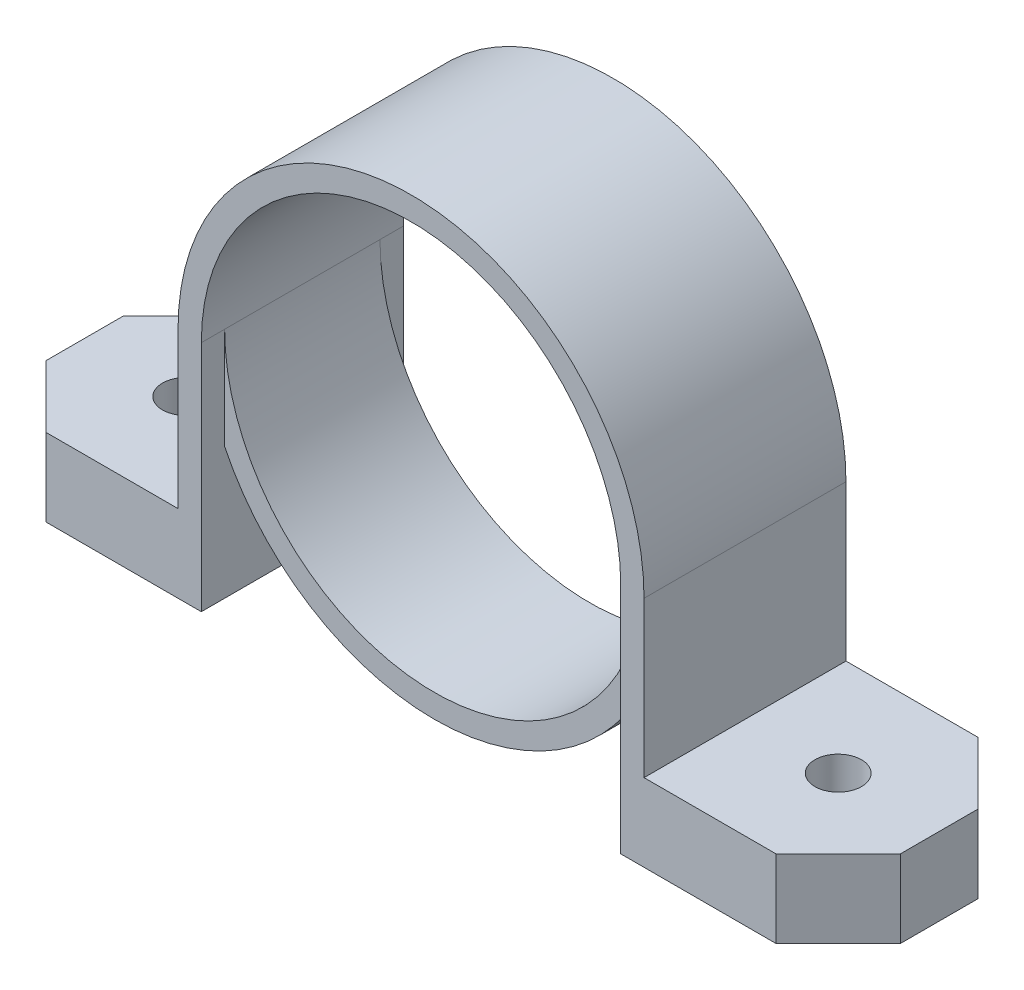
ISO-10303-21;
HEADER;
FILE_DESCRIPTION(('STEP AP214'),'2;1');
FILE_NAME('part.step','',(''),(''),'','','');
FILE_SCHEMA(('AUTOMOTIVE_DESIGN { 1 0 10303 214 1 1 1 1 }'));
ENDSEC;
DATA;
#1=APPLICATION_CONTEXT('core data for automotive mechanical design processes');
#2=APPLICATION_PROTOCOL_DEFINITION('international standard','automotive_design',2000,#1);
#3=PRODUCT_CONTEXT('',#1,'mechanical');
#4=PRODUCT('Part','Part','',(#3));
#5=PRODUCT_RELATED_PRODUCT_CATEGORY('part','',(#4));
#6=PRODUCT_DEFINITION_FORMATION('','',#4);
#7=PRODUCT_DEFINITION_CONTEXT('part definition',#1,'design');
#8=PRODUCT_DEFINITION('design','',#6,#7);
#9=PRODUCT_DEFINITION_SHAPE('','',#8);
#10=(LENGTH_UNIT() NAMED_UNIT(*) SI_UNIT(.MILLI.,.METRE.));
#11=(NAMED_UNIT(*) PLANE_ANGLE_UNIT() SI_UNIT($,.RADIAN.));
#12=(NAMED_UNIT(*) SI_UNIT($,.STERADIAN.) SOLID_ANGLE_UNIT());
#13=UNCERTAINTY_MEASURE_WITH_UNIT(LENGTH_MEASURE(1.E-05),#10,'distance_accuracy_value','');
#14=(GEOMETRIC_REPRESENTATION_CONTEXT(3) GLOBAL_UNCERTAINTY_ASSIGNED_CONTEXT((#13)) GLOBAL_UNIT_ASSIGNED_CONTEXT((#10,
#11,#12)) REPRESENTATION_CONTEXT('',''));
#15=CARTESIAN_POINT('',(0.,0.,0.));
#16=DIRECTION('',(0.,0.,1.));
#17=DIRECTION('',(1.,0.,0.));
#18=AXIS2_PLACEMENT_3D('',#15,#16,#17);
#19=CARTESIAN_POINT('',(0.,0.,-5.));
#20=DIRECTION('',(0.,0.,1.));
#21=DIRECTION('',(1.,0.,0.));
#22=AXIS2_PLACEMENT_3D('',#19,#20,#21);
#23=CYLINDRICAL_SURFACE('',#22,15.);
#24=DIRECTION('',(0.,0.,1.));
#25=VECTOR('',#24,1.);
#26=CARTESIAN_POINT('',(13.5,-6.53834841531101,-5.));
#27=LINE('',#26,#25);
#28=CARTESIAN_POINT('',(13.5,-6.53834841531101,-5.));
#29=VERTEX_POINT('',#28);
#30=CARTESIAN_POINT('',(13.5,-6.53834841531101,5.));
#31=VERTEX_POINT('',#30);
#32=EDGE_CURVE('E56',#29,#31,#27,.T.);
#33=ORIENTED_EDGE('',*,*,#32,.T.);
#34=CARTESIAN_POINT('',(0.,0.,5.));
#35=DIRECTION('',(0.,0.,1.));
#36=DIRECTION('',(1.,0.,0.));
#37=AXIS2_PLACEMENT_3D('',#34,#35,#36);
#38=CIRCLE('',#37,15.);
#39=CARTESIAN_POINT('',(-13.5,-6.53834841531101,5.));
#40=VERTEX_POINT('',#39);
#41=EDGE_CURVE('E93',#40,#31,#38,.T.);
#42=ORIENTED_EDGE('',*,*,#41,.F.);
#43=DIRECTION('',(0.,0.,1.));
#44=VECTOR('',#43,1.);
#45=CARTESIAN_POINT('',(-13.5,-6.53834841531101,-5.));
#46=LINE('',#45,#44);
#47=CARTESIAN_POINT('',(-13.5,-6.53834841531101,-5.));
#48=VERTEX_POINT('',#47);
#49=EDGE_CURVE('E12',#48,#40,#46,.T.);
#50=ORIENTED_EDGE('',*,*,#49,.F.);
#51=CARTESIAN_POINT('',(0.,0.,-5.));
#52=DIRECTION('',(0.,0.,1.));
#53=DIRECTION('',(1.,0.,0.));
#54=AXIS2_PLACEMENT_3D('',#51,#52,#53);
#55=CIRCLE('',#54,15.);
#56=EDGE_CURVE('E95',#48,#29,#55,.T.);
#57=ORIENTED_EDGE('',*,*,#56,.T.);
#58=EDGE_LOOP('',(#33,#42,#50,#57));
#59=FACE_BOUND('',#58,.T.);
#60=ADVANCED_FACE('F53',(#59),#23,.T.);
#61=CARTESIAN_POINT('',(-13.5,0.,-5.));
#62=DIRECTION('',(1.,0.,0.));
#63=DIRECTION('',(0.,1.,0.));
#64=AXIS2_PLACEMENT_3D('',#61,#62,#63);
#65=PLANE('',#64);
#66=ORIENTED_EDGE('',*,*,#49,.T.);
#67=DIRECTION('',(0.,1.,0.));
#68=VECTOR('',#67,1.);
#69=CARTESIAN_POINT('',(-13.5,0.,5.));
#70=LINE('',#69,#68);
#71=CARTESIAN_POINT('',(-13.5,0.,5.));
#72=VERTEX_POINT('',#71);
#73=EDGE_CURVE('E111',#40,#72,#70,.T.);
#74=ORIENTED_EDGE('',*,*,#73,.T.);
#75=DIRECTION('',(0.,0.,1.));
#76=VECTOR('',#75,1.);
#77=CARTESIAN_POINT('',(-13.5,0.,-5.));
#78=LINE('',#77,#76);
#79=CARTESIAN_POINT('',(-13.5,0.,-5.));
#80=VERTEX_POINT('',#79);
#81=EDGE_CURVE('E61',#80,#72,#78,.T.);
#82=ORIENTED_EDGE('',*,*,#81,.F.);
#83=DIRECTION('',(0.,1.,0.));
#84=VECTOR('',#83,1.);
#85=CARTESIAN_POINT('',(-13.5,0.,-5.));
#86=LINE('',#85,#84);
#87=EDGE_CURVE('E74',#48,#80,#86,.T.);
#88=ORIENTED_EDGE('',*,*,#87,.F.);
#89=EDGE_LOOP('',(#66,#74,#82,#88));
#90=FACE_BOUND('',#89,.T.);
#91=ADVANCED_FACE('F126',(#90),#65,.F.);
#92=CARTESIAN_POINT('',(0.,0.,-5.));
#93=DIRECTION('',(0.,0.,1.));
#94=DIRECTION('',(1.,0.,0.));
#95=AXIS2_PLACEMENT_3D('',#92,#93,#94);
#96=CYLINDRICAL_SURFACE('',#95,13.5);
#97=ORIENTED_EDGE('',*,*,#81,.T.);
#98=CARTESIAN_POINT('',(0.,0.,5.));
#99=DIRECTION('',(0.,0.,1.));
#100=DIRECTION('',(1.,0.,0.));
#101=AXIS2_PLACEMENT_3D('',#98,#99,#100);
#102=CIRCLE('',#101,13.5);
#103=CARTESIAN_POINT('',(13.5,0.,5.));
#104=VERTEX_POINT('',#103);
#105=EDGE_CURVE('E107',#72,#104,#102,.T.);
#106=ORIENTED_EDGE('',*,*,#105,.T.);
#107=DIRECTION('',(0.,0.,1.));
#108=VECTOR('',#107,1.);
#109=CARTESIAN_POINT('',(13.5,0.,-5.));
#110=LINE('',#109,#108);
#111=CARTESIAN_POINT('',(13.5,0.,-5.));
#112=VERTEX_POINT('',#111);
#113=EDGE_CURVE('E99',#112,#104,#110,.T.);
#114=ORIENTED_EDGE('',*,*,#113,.F.);
#115=CARTESIAN_POINT('',(0.,0.,-5.));
#116=DIRECTION('',(0.,0.,1.));
#117=DIRECTION('',(1.,0.,0.));
#118=AXIS2_PLACEMENT_3D('',#115,#116,#117);
#119=CIRCLE('',#118,13.5);
#120=EDGE_CURVE('E119',#80,#112,#119,.T.);
#121=ORIENTED_EDGE('',*,*,#120,.F.);
#122=EDGE_LOOP('',(#97,#106,#114,#121));
#123=FACE_BOUND('',#122,.T.);
#124=ADVANCED_FACE('F124',(#123),#96,.F.);
#125=CARTESIAN_POINT('',(13.5,0.,-5.));
#126=DIRECTION('',(1.,0.,0.));
#127=DIRECTION('',(0.,1.,0.));
#128=AXIS2_PLACEMENT_3D('',#125,#126,#127);
#129=PLANE('',#128);
#130=ORIENTED_EDGE('',*,*,#113,.T.);
#131=DIRECTION('',(0.,1.,0.));
#132=VECTOR('',#131,1.);
#133=CARTESIAN_POINT('',(13.5,0.,5.));
#134=LINE('',#133,#132);
#135=EDGE_CURVE('E101',#31,#104,#134,.T.);
#136=ORIENTED_EDGE('',*,*,#135,.F.);
#137=ORIENTED_EDGE('',*,*,#32,.F.);
#138=DIRECTION('',(0.,1.,0.));
#139=VECTOR('',#138,1.);
#140=CARTESIAN_POINT('',(13.5,0.,-5.));
#141=LINE('',#140,#139);
#142=EDGE_CURVE('E117',#29,#112,#141,.T.);
#143=ORIENTED_EDGE('',*,*,#142,.T.);
#144=EDGE_LOOP('',(#130,#136,#137,#143));
#145=FACE_BOUND('',#144,.T.);
#146=ADVANCED_FACE('F102',(#145),#129,.T.);
#147=CARTESIAN_POINT('',(0.,0.,-5.));
#148=DIRECTION('',(0.,0.,1.));
#149=DIRECTION('',(1.,0.,0.));
#150=AXIS2_PLACEMENT_3D('',#147,#148,#149);
#151=PLANE('',#150);
#152=ORIENTED_EDGE('',*,*,#56,.F.);
#153=ORIENTED_EDGE('',*,*,#87,.T.);
#154=ORIENTED_EDGE('',*,*,#120,.T.);
#155=ORIENTED_EDGE('',*,*,#142,.F.);
#156=EDGE_LOOP('',(#152,#153,#154,#155));
#157=FACE_BOUND('',#156,.T.);
#158=ADVANCED_FACE('F127',(#157),#151,.F.);
#159=CARTESIAN_POINT('',(0.,0.,5.));
#160=DIRECTION('',(0.,0.,1.));
#161=DIRECTION('',(1.,0.,0.));
#162=AXIS2_PLACEMENT_3D('',#159,#160,#161);
#163=PLANE('',#162);
#164=ORIENTED_EDGE('',*,*,#41,.T.);
#165=ORIENTED_EDGE('',*,*,#135,.T.);
#166=ORIENTED_EDGE('',*,*,#105,.F.);
#167=ORIENTED_EDGE('',*,*,#73,.F.);
#168=EDGE_LOOP('',(#164,#165,#166,#167));
#169=FACE_BOUND('',#168,.T.);
#170=ADVANCED_FACE('F109',(#169),#163,.T.);
#171=CLOSED_SHELL('',(#60,#91,#124,#146,#158,#170));
#172=MANIFOLD_SOLID_BREP('B2',#171);
#173=CARTESIAN_POINT('',(0.,0.,-6.5));
#174=DIRECTION('',(0.,0.,1.));
#175=DIRECTION('',(1.,0.,0.));
#176=AXIS2_PLACEMENT_3D('',#173,#174,#175);
#177=CYLINDRICAL_SURFACE('',#176,13.5);
#178=DIRECTION('',(0.,0.,1.));
#179=VECTOR('',#178,1.);
#180=CARTESIAN_POINT('',(13.5,0.,-6.5));
#181=LINE('',#180,#179);
#182=CARTESIAN_POINT('',(13.5,0.,-6.5));
#183=VERTEX_POINT('',#182);
#184=CARTESIAN_POINT('',(13.5,0.,6.5));
#185=VERTEX_POINT('',#184);
#186=EDGE_CURVE('E378',#183,#185,#181,.T.);
#187=ORIENTED_EDGE('',*,*,#186,.T.);
#188=CARTESIAN_POINT('',(0.,0.,6.5));
#189=DIRECTION('',(0.,0.,1.));
#190=DIRECTION('',(1.,0.,0.));
#191=AXIS2_PLACEMENT_3D('',#188,#189,#190);
#192=CIRCLE('',#191,13.5);
#193=CARTESIAN_POINT('',(-13.5,0.,6.5));
#194=VERTEX_POINT('',#193);
#195=EDGE_CURVE('E442',#185,#194,#192,.T.);
#196=ORIENTED_EDGE('',*,*,#195,.T.);
#197=DIRECTION('',(0.,0.,1.));
#198=VECTOR('',#197,1.);
#199=CARTESIAN_POINT('',(-13.5,0.,-6.5));
#200=LINE('',#199,#198);
#201=CARTESIAN_POINT('',(-13.5,0.,-6.5));
#202=VERTEX_POINT('',#201);
#203=EDGE_CURVE('E308',#202,#194,#200,.T.);
#204=ORIENTED_EDGE('',*,*,#203,.F.);
#205=CARTESIAN_POINT('',(0.,0.,-6.5));
#206=DIRECTION('',(0.,0.,1.));
#207=DIRECTION('',(1.,0.,0.));
#208=AXIS2_PLACEMENT_3D('',#205,#206,#207);
#209=CIRCLE('',#208,13.5);
#210=EDGE_CURVE('E341',#183,#202,#209,.T.);
#211=ORIENTED_EDGE('',*,*,#210,.F.);
#212=EDGE_LOOP('',(#187,#196,#204,#211));
#213=FACE_BOUND('',#212,.T.);
#214=ADVANCED_FACE('F183',(#213),#177,.F.);
#215=CARTESIAN_POINT('',(-13.5,0.,-6.5));
#216=DIRECTION('',(-1.,0.,0.));
#217=DIRECTION('',(0.,-1.,0.));
#218=AXIS2_PLACEMENT_3D('',#215,#216,#217);
#219=PLANE('',#218);
#220=ORIENTED_EDGE('',*,*,#203,.T.);
#221=DIRECTION('',(0.,-1.,0.));
#222=VECTOR('',#221,1.);
#223=CARTESIAN_POINT('',(-13.5,0.,6.5));
#224=LINE('',#223,#222);
#225=CARTESIAN_POINT('',(-13.5,-15.,6.5));
#226=VERTEX_POINT('',#225);
#227=EDGE_CURVE('E332',#194,#226,#224,.T.);
#228=ORIENTED_EDGE('',*,*,#227,.T.);
#229=DIRECTION('',(0.,0.,1.));
#230=VECTOR('',#229,1.);
#231=CARTESIAN_POINT('',(-13.5,-15.,-6.5));
#232=LINE('',#231,#230);
#233=CARTESIAN_POINT('',(-13.5,-15.,-6.5));
#234=VERTEX_POINT('',#233);
#235=EDGE_CURVE('E381',#234,#226,#232,.T.);
#236=ORIENTED_EDGE('',*,*,#235,.F.);
#237=DIRECTION('',(0.,-1.,0.));
#238=VECTOR('',#237,1.);
#239=CARTESIAN_POINT('',(-13.5,0.,-6.5));
#240=LINE('',#239,#238);
#241=EDGE_CURVE('E374',#202,#234,#240,.T.);
#242=ORIENTED_EDGE('',*,*,#241,.F.);
#243=EDGE_LOOP('',(#220,#228,#236,#242));
#244=FACE_BOUND('',#243,.T.);
#245=ADVANCED_FACE('F538',(#244),#219,.F.);
#246=CARTESIAN_POINT('',(0.,-15.,-6.5));
#247=DIRECTION('',(0.,-1.,0.));
#248=DIRECTION('',(1.,0.,0.));
#249=AXIS2_PLACEMENT_3D('',#246,#247,#248);
#250=PLANE('',#249);
#251=DIRECTION('',(-0.707106781186549,0.,0.707106781186546));
#252=VECTOR('',#251,1.);
#253=CARTESIAN_POINT('',(-11.75,-15.,-18.25));
#254=LINE('',#253,#252);
#255=CARTESIAN_POINT('',(-23.5,-15.,-6.5));
#256=VERTEX_POINT('',#255);
#257=CARTESIAN_POINT('',(-27.5,-15.,-2.5));
#258=VERTEX_POINT('',#257);
#259=EDGE_CURVE('E423',#256,#258,#254,.T.);
#260=ORIENTED_EDGE('',*,*,#259,.F.);
#261=DIRECTION('',(1.,0.,0.));
#262=VECTOR('',#261,1.);
#263=CARTESIAN_POINT('',(0.,-15.,-6.5));
#264=LINE('',#263,#262);
#265=EDGE_CURVE('E371',#256,#234,#264,.T.);
#266=ORIENTED_EDGE('',*,*,#265,.T.);
#267=ORIENTED_EDGE('',*,*,#235,.T.);
#268=DIRECTION('',(1.,0.,0.));
#269=VECTOR('',#268,1.);
#270=CARTESIAN_POINT('',(0.,-15.,6.5));
#271=LINE('',#270,#269);
#272=CARTESIAN_POINT('',(-23.5,-15.,6.5));
#273=VERTEX_POINT('',#272);
#274=EDGE_CURVE('E328',#273,#226,#271,.T.);
#275=ORIENTED_EDGE('',*,*,#274,.F.);
#276=DIRECTION('',(0.707106781186549,0.,0.707106781186546));
#277=VECTOR('',#276,1.);
#278=CARTESIAN_POINT('',(-18.2499999999999,-15.,11.75));
#279=LINE('',#278,#277);
#280=CARTESIAN_POINT('',(-27.5,-15.,2.5));
#281=VERTEX_POINT('',#280);
#282=EDGE_CURVE('E302',#281,#273,#279,.T.);
#283=ORIENTED_EDGE('',*,*,#282,.F.);
#284=DIRECTION('',(0.,0.,1.));
#285=VECTOR('',#284,1.);
#286=CARTESIAN_POINT('',(-27.5,-15.,-6.5));
#287=LINE('',#286,#285);
#288=EDGE_CURVE('E385',#258,#281,#287,.T.);
#289=ORIENTED_EDGE('',*,*,#288,.F.);
#290=EDGE_LOOP('',(#260,#266,#267,#275,#283,#289));
#291=FACE_BOUND('',#290,.T.);
#292=CARTESIAN_POINT('',(-21.,-15.,0.));
#293=DIRECTION('',(0.,-1.,0.));
#294=DIRECTION('',(1.,0.,0.));
#295=AXIS2_PLACEMENT_3D('',#292,#293,#294);
#296=CIRCLE('',#295,1.5);
#297=CARTESIAN_POINT('',(-19.5,-15.,0.));
#298=VERTEX_POINT('',#297);
#299=EDGE_CURVE('E438',#298,#298,#296,.T.);
#300=ORIENTED_EDGE('',*,*,#299,.F.);
#301=EDGE_LOOP('',(#300));
#302=FACE_BOUND('',#301,.T.);
#303=ADVANCED_FACE('F477',(#291,#302),#250,.T.);
#304=CARTESIAN_POINT('',(-27.5,0.,-6.5));
#305=DIRECTION('',(-1.,0.,0.));
#306=DIRECTION('',(0.,0.,1.));
#307=AXIS2_PLACEMENT_3D('',#304,#305,#306);
#308=PLANE('',#307);
#309=DIRECTION('',(0.,-1.,0.));
#310=VECTOR('',#309,1.);
#311=CARTESIAN_POINT('',(-27.5,15.,-2.5));
#312=LINE('',#311,#310);
#313=CARTESIAN_POINT('',(-27.5,-10.,-2.5));
#314=VERTEX_POINT('',#313);
#315=EDGE_CURVE('E481',#314,#258,#312,.T.);
#316=ORIENTED_EDGE('',*,*,#315,.T.);
#317=ORIENTED_EDGE('',*,*,#288,.T.);
#318=DIRECTION('',(0.,-1.,0.));
#319=VECTOR('',#318,1.);
#320=CARTESIAN_POINT('',(-27.5,15.,2.5));
#321=LINE('',#320,#319);
#322=CARTESIAN_POINT('',(-27.5,-10.,2.5));
#323=VERTEX_POINT('',#322);
#324=EDGE_CURVE('E319',#323,#281,#321,.T.);
#325=ORIENTED_EDGE('',*,*,#324,.F.);
#326=DIRECTION('',(0.,0.,1.));
#327=VECTOR('',#326,1.);
#328=CARTESIAN_POINT('',(-27.5,-10.,-6.5));
#329=LINE('',#328,#327);
#330=EDGE_CURVE('E317',#314,#323,#329,.T.);
#331=ORIENTED_EDGE('',*,*,#330,.F.);
#332=EDGE_LOOP('',(#316,#317,#325,#331));
#333=FACE_BOUND('',#332,.T.);
#334=ADVANCED_FACE('F480',(#333),#308,.T.);
#335=CARTESIAN_POINT('',(0.,-10.,-6.5));
#336=DIRECTION('',(0.,1.,0.));
#337=DIRECTION('',(0.,0.,1.));
#338=AXIS2_PLACEMENT_3D('',#335,#336,#337);
#339=PLANE('',#338);
#340=DIRECTION('',(0.707106781186549,0.,-0.707106781186546));
#341=VECTOR('',#340,1.);
#342=CARTESIAN_POINT('',(-11.75,-10.,-18.25));
#343=LINE('',#342,#341);
#344=CARTESIAN_POINT('',(-23.5,-10.,-6.5));
#345=VERTEX_POINT('',#344);
#346=EDGE_CURVE('E208',#314,#345,#343,.T.);
#347=ORIENTED_EDGE('',*,*,#346,.F.);
#348=ORIENTED_EDGE('',*,*,#330,.T.);
#349=DIRECTION('',(-0.707106781186549,0.,-0.707106781186546));
#350=VECTOR('',#349,1.);
#351=CARTESIAN_POINT('',(-18.25,-10.,11.75));
#352=LINE('',#351,#350);
#353=CARTESIAN_POINT('',(-23.5,-10.,6.5));
#354=VERTEX_POINT('',#353);
#355=EDGE_CURVE('E299',#354,#323,#352,.T.);
#356=ORIENTED_EDGE('',*,*,#355,.F.);
#357=DIRECTION('',(-1.,0.,0.));
#358=VECTOR('',#357,1.);
#359=CARTESIAN_POINT('',(0.,-10.,6.5));
#360=LINE('',#359,#358);
#361=CARTESIAN_POINT('',(-15.,-10.,6.5));
#362=VERTEX_POINT('',#361);
#363=EDGE_CURVE('E315',#362,#354,#360,.T.);
#364=ORIENTED_EDGE('',*,*,#363,.F.);
#365=DIRECTION('',(0.,0.,1.));
#366=VECTOR('',#365,1.);
#367=CARTESIAN_POINT('',(-15.,-10.,-6.5));
#368=LINE('',#367,#366);
#369=CARTESIAN_POINT('',(-15.,-10.,-6.5));
#370=VERTEX_POINT('',#369);
#371=EDGE_CURVE('E391',#370,#362,#368,.T.);
#372=ORIENTED_EDGE('',*,*,#371,.F.);
#373=DIRECTION('',(-1.,0.,0.));
#374=VECTOR('',#373,1.);
#375=CARTESIAN_POINT('',(0.,-10.,-6.5));
#376=LINE('',#375,#374);
#377=EDGE_CURVE('E367',#370,#345,#376,.T.);
#378=ORIENTED_EDGE('',*,*,#377,.T.);
#379=EDGE_LOOP('',(#347,#348,#356,#364,#372,#378));
#380=FACE_BOUND('',#379,.T.);
#381=CARTESIAN_POINT('',(-21.,-10.,0.));
#382=DIRECTION('',(0.,1.,0.));
#383=DIRECTION('',(0.,0.,1.));
#384=AXIS2_PLACEMENT_3D('',#381,#382,#383);
#385=CIRCLE('',#384,1.5);
#386=CARTESIAN_POINT('',(-19.5,-10.,0.));
#387=VERTEX_POINT('',#386);
#388=EDGE_CURVE('E186',#387,#387,#385,.T.);
#389=ORIENTED_EDGE('',*,*,#388,.F.);
#390=EDGE_LOOP('',(#389));
#391=FACE_BOUND('',#390,.T.);
#392=ADVANCED_FACE('F313',(#380,#391),#339,.T.);
#393=CARTESIAN_POINT('',(-15.,0.,-6.5));
#394=DIRECTION('',(-1.,0.,0.));
#395=DIRECTION('',(0.,-1.,0.));
#396=AXIS2_PLACEMENT_3D('',#393,#394,#395);
#397=PLANE('',#396);
#398=ORIENTED_EDGE('',*,*,#371,.T.);
#399=DIRECTION('',(0.,-1.,0.));
#400=VECTOR('',#399,1.);
#401=CARTESIAN_POINT('',(-15.,0.,6.5));
#402=LINE('',#401,#400);
#403=CARTESIAN_POINT('',(-15.,0.,6.5));
#404=VERTEX_POINT('',#403);
#405=EDGE_CURVE('E326',#404,#362,#402,.T.);
#406=ORIENTED_EDGE('',*,*,#405,.F.);
#407=DIRECTION('',(0.,0.,1.));
#408=VECTOR('',#407,1.);
#409=CARTESIAN_POINT('',(-15.,0.,-6.5));
#410=LINE('',#409,#408);
#411=CARTESIAN_POINT('',(-15.,0.,-6.5));
#412=VERTEX_POINT('',#411);
#413=EDGE_CURVE('E394',#412,#404,#410,.T.);
#414=ORIENTED_EDGE('',*,*,#413,.F.);
#415=DIRECTION('',(0.,-1.,0.));
#416=VECTOR('',#415,1.);
#417=CARTESIAN_POINT('',(-15.,0.,-6.5));
#418=LINE('',#417,#416);
#419=EDGE_CURVE('E363',#412,#370,#418,.T.);
#420=ORIENTED_EDGE('',*,*,#419,.T.);
#421=EDGE_LOOP('',(#398,#406,#414,#420));
#422=FACE_BOUND('',#421,.T.);
#423=ADVANCED_FACE('F467',(#422),#397,.T.);
#424=CARTESIAN_POINT('',(0.,0.,-6.5));
#425=DIRECTION('',(0.,0.,1.));
#426=DIRECTION('',(1.,0.,0.));
#427=AXIS2_PLACEMENT_3D('',#424,#425,#426);
#428=CYLINDRICAL_SURFACE('',#427,15.);
#429=ORIENTED_EDGE('',*,*,#413,.T.);
#430=CARTESIAN_POINT('',(0.,0.,6.5));
#431=DIRECTION('',(0.,0.,1.));
#432=DIRECTION('',(1.,0.,0.));
#433=AXIS2_PLACEMENT_3D('',#430,#431,#432);
#434=CIRCLE('',#433,15.);
#435=CARTESIAN_POINT('',(15.,0.,6.5));
#436=VERTEX_POINT('',#435);
#437=EDGE_CURVE('E334',#436,#404,#434,.T.);
#438=ORIENTED_EDGE('',*,*,#437,.F.);
#439=DIRECTION('',(0.,0.,1.));
#440=VECTOR('',#439,1.);
#441=CARTESIAN_POINT('',(15.,0.,-6.5));
#442=LINE('',#441,#440);
#443=CARTESIAN_POINT('',(15.,0.,-6.5));
#444=VERTEX_POINT('',#443);
#445=EDGE_CURVE('E397',#444,#436,#442,.T.);
#446=ORIENTED_EDGE('',*,*,#445,.F.);
#447=CARTESIAN_POINT('',(0.,0.,-6.5));
#448=DIRECTION('',(0.,0.,1.));
#449=DIRECTION('',(1.,0.,0.));
#450=AXIS2_PLACEMENT_3D('',#447,#448,#449);
#451=CIRCLE('',#450,15.);
#452=EDGE_CURVE('E359',#444,#412,#451,.T.);
#453=ORIENTED_EDGE('',*,*,#452,.T.);
#454=EDGE_LOOP('',(#429,#438,#446,#453));
#455=FACE_BOUND('',#454,.T.);
#456=ADVANCED_FACE('F569',(#455),#428,.T.);
#457=CARTESIAN_POINT('',(15.,0.,-6.5));
#458=DIRECTION('',(-1.,0.,0.));
#459=DIRECTION('',(0.,-1.,0.));
#460=AXIS2_PLACEMENT_3D('',#457,#458,#459);
#461=PLANE('',#460);
#462=ORIENTED_EDGE('',*,*,#445,.T.);
#463=DIRECTION('',(0.,-1.,0.));
#464=VECTOR('',#463,1.);
#465=CARTESIAN_POINT('',(15.,0.,6.5));
#466=LINE('',#465,#464);
#467=CARTESIAN_POINT('',(15.,-9.99999999999999,6.5));
#468=VERTEX_POINT('',#467);
#469=EDGE_CURVE('E458',#436,#468,#466,.T.);
#470=ORIENTED_EDGE('',*,*,#469,.T.);
#471=DIRECTION('',(0.,0.,1.));
#472=VECTOR('',#471,1.);
#473=CARTESIAN_POINT('',(15.,-9.99999999999999,-6.5));
#474=LINE('',#473,#472);
#475=CARTESIAN_POINT('',(15.,-9.99999999999999,-6.5));
#476=VERTEX_POINT('',#475);
#477=EDGE_CURVE('E400',#476,#468,#474,.T.);
#478=ORIENTED_EDGE('',*,*,#477,.F.);
#479=DIRECTION('',(0.,-1.,0.));
#480=VECTOR('',#479,1.);
#481=CARTESIAN_POINT('',(15.,0.,-6.5));
#482=LINE('',#481,#480);
#483=EDGE_CURVE('E356',#444,#476,#482,.T.);
#484=ORIENTED_EDGE('',*,*,#483,.F.);
#485=EDGE_LOOP('',(#462,#470,#478,#484));
#486=FACE_BOUND('',#485,.T.);
#487=ADVANCED_FACE('F514',(#486),#461,.F.);
#488=CARTESIAN_POINT('',(0.,-10.,-6.5));
#489=DIRECTION('',(0.,-1.,0.));
#490=DIRECTION('',(1.,0.,0.));
#491=AXIS2_PLACEMENT_3D('',#488,#489,#490);
#492=PLANE('',#491);
#493=CARTESIAN_POINT('',(21.,-9.99999999999999,0.));
#494=DIRECTION('',(0.,-1.,0.));
#495=DIRECTION('',(1.,0.,0.));
#496=AXIS2_PLACEMENT_3D('',#493,#494,#495);
#497=CIRCLE('',#496,1.5);
#498=CARTESIAN_POINT('',(22.5,-9.99999999999999,0.));
#499=VERTEX_POINT('',#498);
#500=EDGE_CURVE('E422',#499,#499,#497,.T.);
#501=ORIENTED_EDGE('',*,*,#500,.T.);
#502=EDGE_LOOP('',(#501));
#503=FACE_BOUND('',#502,.T.);
#504=DIRECTION('',(1.,0.,0.));
#505=VECTOR('',#504,1.);
#506=CARTESIAN_POINT('',(0.,-10.,6.5));
#507=LINE('',#506,#505);
#508=CARTESIAN_POINT('',(23.5,-9.99999999999999,6.5));
#509=VERTEX_POINT('',#508);
#510=EDGE_CURVE('E454',#468,#509,#507,.T.);
#511=ORIENTED_EDGE('',*,*,#510,.T.);
#512=DIRECTION('',(0.707106781186549,0.,-0.707106781186546));
#513=VECTOR('',#512,1.);
#514=CARTESIAN_POINT('',(18.25,-9.99999999999999,11.75));
#515=LINE('',#514,#513);
#516=CARTESIAN_POINT('',(27.5,-9.99999999999999,2.5));
#517=VERTEX_POINT('',#516);
#518=EDGE_CURVE('E498',#509,#517,#515,.T.);
#519=ORIENTED_EDGE('',*,*,#518,.T.);
#520=DIRECTION('',(0.,0.,1.));
#521=VECTOR('',#520,1.);
#522=CARTESIAN_POINT('',(27.5,-9.99999999999999,-6.5));
#523=LINE('',#522,#521);
#524=CARTESIAN_POINT('',(27.5,-9.99999999999999,-2.5));
#525=VERTEX_POINT('',#524);
#526=EDGE_CURVE('E403',#525,#517,#523,.T.);
#527=ORIENTED_EDGE('',*,*,#526,.F.);
#528=DIRECTION('',(-0.707106781186549,0.,-0.707106781186546));
#529=VECTOR('',#528,1.);
#530=CARTESIAN_POINT('',(11.7499999999999,-9.99999999999999,-18.25));
#531=LINE('',#530,#529);
#532=CARTESIAN_POINT('',(23.5,-9.99999999999999,-6.49999999999999));
#533=VERTEX_POINT('',#532);
#534=EDGE_CURVE('E434',#525,#533,#531,.T.);
#535=ORIENTED_EDGE('',*,*,#534,.T.);
#536=DIRECTION('',(1.,0.,0.));
#537=VECTOR('',#536,1.);
#538=CARTESIAN_POINT('',(0.,-10.,-6.5));
#539=LINE('',#538,#537);
#540=EDGE_CURVE('E352',#476,#533,#539,.T.);
#541=ORIENTED_EDGE('',*,*,#540,.F.);
#542=ORIENTED_EDGE('',*,*,#477,.T.);
#543=EDGE_LOOP('',(#511,#519,#527,#535,#541,#542));
#544=FACE_BOUND('',#543,.T.);
#545=ADVANCED_FACE('F508',(#503,#544),#492,.F.);
#546=CARTESIAN_POINT('',(27.5,0.,-6.5));
#547=DIRECTION('',(-1.,0.,0.));
#548=DIRECTION('',(0.,0.,1.));
#549=AXIS2_PLACEMENT_3D('',#546,#547,#548);
#550=PLANE('',#549);
#551=ORIENTED_EDGE('',*,*,#526,.T.);
#552=DIRECTION('',(0.,-1.,0.));
#553=VECTOR('',#552,1.);
#554=CARTESIAN_POINT('',(27.5,15.,2.5));
#555=LINE('',#554,#553);
#556=CARTESIAN_POINT('',(27.5,-15.,2.5));
#557=VERTEX_POINT('',#556);
#558=EDGE_CURVE('E483',#517,#557,#555,.T.);
#559=ORIENTED_EDGE('',*,*,#558,.T.);
#560=DIRECTION('',(0.,0.,1.));
#561=VECTOR('',#560,1.);
#562=CARTESIAN_POINT('',(27.5,-15.,-6.5));
#563=LINE('',#562,#561);
#564=CARTESIAN_POINT('',(27.5,-15.,-2.5));
#565=VERTEX_POINT('',#564);
#566=EDGE_CURVE('E407',#565,#557,#563,.T.);
#567=ORIENTED_EDGE('',*,*,#566,.F.);
#568=DIRECTION('',(0.,-1.,0.));
#569=VECTOR('',#568,1.);
#570=CARTESIAN_POINT('',(27.5,15.,-2.5));
#571=LINE('',#570,#569);
#572=EDGE_CURVE('E489',#525,#565,#571,.T.);
#573=ORIENTED_EDGE('',*,*,#572,.F.);
#574=EDGE_LOOP('',(#551,#559,#567,#573));
#575=FACE_BOUND('',#574,.T.);
#576=ADVANCED_FACE('F525',(#575),#550,.F.);
#577=CARTESIAN_POINT('',(0.,-15.,-6.5));
#578=DIRECTION('',(0.,-1.,0.));
#579=DIRECTION('',(1.,0.,0.));
#580=AXIS2_PLACEMENT_3D('',#577,#578,#579);
#581=PLANE('',#580);
#582=DIRECTION('',(0.707106781186549,0.,-0.707106781186546));
#583=VECTOR('',#582,1.);
#584=CARTESIAN_POINT('',(18.25,-15.,11.75));
#585=LINE('',#584,#583);
#586=CARTESIAN_POINT('',(23.5,-15.,6.5));
#587=VERTEX_POINT('',#586);
#588=EDGE_CURVE('E495',#587,#557,#585,.T.);
#589=ORIENTED_EDGE('',*,*,#588,.F.);
#590=DIRECTION('',(1.,0.,0.));
#591=VECTOR('',#590,1.);
#592=CARTESIAN_POINT('',(0.,-15.,6.5));
#593=LINE('',#592,#591);
#594=CARTESIAN_POINT('',(13.5,-15.,6.5));
#595=VERTEX_POINT('',#594);
#596=EDGE_CURVE('E450',#595,#587,#593,.T.);
#597=ORIENTED_EDGE('',*,*,#596,.F.);
#598=DIRECTION('',(0.,0.,1.));
#599=VECTOR('',#598,1.);
#600=CARTESIAN_POINT('',(13.5,-15.,-6.5));
#601=LINE('',#600,#599);
#602=CARTESIAN_POINT('',(13.5,-15.,-6.5));
#603=VERTEX_POINT('',#602);
#604=EDGE_CURVE('E411',#603,#595,#601,.T.);
#605=ORIENTED_EDGE('',*,*,#604,.F.);
#606=DIRECTION('',(1.,0.,0.));
#607=VECTOR('',#606,1.);
#608=CARTESIAN_POINT('',(0.,-15.,-6.5));
#609=LINE('',#608,#607);
#610=CARTESIAN_POINT('',(23.5,-15.,-6.5));
#611=VERTEX_POINT('',#610);
#612=EDGE_CURVE('E348',#603,#611,#609,.T.);
#613=ORIENTED_EDGE('',*,*,#612,.T.);
#614=DIRECTION('',(-0.707106781186549,0.,-0.707106781186546));
#615=VECTOR('',#614,1.);
#616=CARTESIAN_POINT('',(11.7499999999999,-15.,-18.25));
#617=LINE('',#616,#615);
#618=EDGE_CURVE('E200',#565,#611,#617,.T.);
#619=ORIENTED_EDGE('',*,*,#618,.F.);
#620=ORIENTED_EDGE('',*,*,#566,.T.);
#621=EDGE_LOOP('',(#589,#597,#605,#613,#619,#620));
#622=FACE_BOUND('',#621,.T.);
#623=CARTESIAN_POINT('',(21.,-15.,0.));
#624=DIRECTION('',(0.,-1.,0.));
#625=DIRECTION('',(1.,0.,0.));
#626=AXIS2_PLACEMENT_3D('',#623,#624,#625);
#627=CIRCLE('',#626,1.5);
#628=CARTESIAN_POINT('',(22.5,-15.,0.));
#629=VERTEX_POINT('',#628);
#630=EDGE_CURVE('E419',#629,#629,#627,.T.);
#631=ORIENTED_EDGE('',*,*,#630,.F.);
#632=EDGE_LOOP('',(#631));
#633=FACE_BOUND('',#632,.T.);
#634=ADVANCED_FACE('F521',(#622,#633),#581,.T.);
#635=CARTESIAN_POINT('',(13.5,0.,-6.5));
#636=DIRECTION('',(1.,0.,0.));
#637=DIRECTION('',(0.,1.,0.));
#638=AXIS2_PLACEMENT_3D('',#635,#636,#637);
#639=PLANE('',#638);
#640=ORIENTED_EDGE('',*,*,#604,.T.);
#641=DIRECTION('',(0.,1.,0.));
#642=VECTOR('',#641,1.);
#643=CARTESIAN_POINT('',(13.5,0.,6.5));
#644=LINE('',#643,#642);
#645=EDGE_CURVE('E446',#595,#185,#644,.T.);
#646=ORIENTED_EDGE('',*,*,#645,.T.);
#647=ORIENTED_EDGE('',*,*,#186,.F.);
#648=DIRECTION('',(0.,1.,0.));
#649=VECTOR('',#648,1.);
#650=CARTESIAN_POINT('',(13.5,0.,-6.5));
#651=LINE('',#650,#649);
#652=EDGE_CURVE('E345',#603,#183,#651,.T.);
#653=ORIENTED_EDGE('',*,*,#652,.F.);
#654=EDGE_LOOP('',(#640,#646,#647,#653));
#655=FACE_BOUND('',#654,.T.);
#656=ADVANCED_FACE('F552',(#655),#639,.F.);
#657=CARTESIAN_POINT('',(0.,0.,-6.5));
#658=DIRECTION('',(0.,0.,1.));
#659=DIRECTION('',(1.,0.,0.));
#660=AXIS2_PLACEMENT_3D('',#657,#658,#659);
#661=PLANE('',#660);
#662=ORIENTED_EDGE('',*,*,#265,.F.);
#663=DIRECTION('',(0.,1.,0.));
#664=VECTOR('',#663,1.);
#665=CARTESIAN_POINT('',(-23.5,0.,-6.5));
#666=LINE('',#665,#664);
#667=EDGE_CURVE('E51',#256,#345,#666,.T.);
#668=ORIENTED_EDGE('',*,*,#667,.T.);
#669=ORIENTED_EDGE('',*,*,#377,.F.);
#670=ORIENTED_EDGE('',*,*,#419,.F.);
#671=ORIENTED_EDGE('',*,*,#452,.F.);
#672=ORIENTED_EDGE('',*,*,#483,.T.);
#673=ORIENTED_EDGE('',*,*,#540,.T.);
#674=DIRECTION('',(0.,-1.,0.));
#675=VECTOR('',#674,1.);
#676=CARTESIAN_POINT('',(23.5,0.,-6.5));
#677=LINE('',#676,#675);
#678=EDGE_CURVE('E192',#533,#611,#677,.T.);
#679=ORIENTED_EDGE('',*,*,#678,.T.);
#680=ORIENTED_EDGE('',*,*,#612,.F.);
#681=ORIENTED_EDGE('',*,*,#652,.T.);
#682=ORIENTED_EDGE('',*,*,#210,.T.);
#683=ORIENTED_EDGE('',*,*,#241,.T.);
#684=EDGE_LOOP('',(#662,#668,#669,#670,#671,#672,#673,#679,#680,#681,#682,#683));
#685=FACE_BOUND('',#684,.T.);
#686=ADVANCED_FACE('F472',(#685),#661,.F.);
#687=CARTESIAN_POINT('',(0.,0.,6.5));
#688=DIRECTION('',(0.,0.,1.));
#689=DIRECTION('',(1.,0.,0.));
#690=AXIS2_PLACEMENT_3D('',#687,#688,#689);
#691=PLANE('',#690);
#692=DIRECTION('',(0.,-1.,0.));
#693=VECTOR('',#692,1.);
#694=CARTESIAN_POINT('',(23.5,0.,6.5));
#695=LINE('',#694,#693);
#696=EDGE_CURVE('E307',#509,#587,#695,.T.);
#697=ORIENTED_EDGE('',*,*,#696,.F.);
#698=ORIENTED_EDGE('',*,*,#510,.F.);
#699=ORIENTED_EDGE('',*,*,#469,.F.);
#700=ORIENTED_EDGE('',*,*,#437,.T.);
#701=ORIENTED_EDGE('',*,*,#405,.T.);
#702=ORIENTED_EDGE('',*,*,#363,.T.);
#703=DIRECTION('',(0.,1.,0.));
#704=VECTOR('',#703,1.);
#705=CARTESIAN_POINT('',(-23.5,0.,6.5));
#706=LINE('',#705,#704);
#707=EDGE_CURVE('E296',#273,#354,#706,.T.);
#708=ORIENTED_EDGE('',*,*,#707,.F.);
#709=ORIENTED_EDGE('',*,*,#274,.T.);
#710=ORIENTED_EDGE('',*,*,#227,.F.);
#711=ORIENTED_EDGE('',*,*,#195,.F.);
#712=ORIENTED_EDGE('',*,*,#645,.F.);
#713=ORIENTED_EDGE('',*,*,#596,.T.);
#714=EDGE_LOOP('',(#697,#698,#699,#700,#701,#702,#708,#709,#710,#711,#712,#713));
#715=FACE_BOUND('',#714,.T.);
#716=ADVANCED_FACE('F323',(#715),#691,.T.);
#717=CARTESIAN_POINT('',(-27.5,15.,2.5));
#718=DIRECTION('',(0.707106781186546,0.,-0.707106781186549));
#719=DIRECTION('',(-0.707106781186549,0.,-0.707106781186546));
#720=AXIS2_PLACEMENT_3D('',#717,#718,#719);
#721=PLANE('',#720);
#722=ORIENTED_EDGE('',*,*,#282,.T.);
#723=ORIENTED_EDGE('',*,*,#707,.T.);
#724=ORIENTED_EDGE('',*,*,#355,.T.);
#725=ORIENTED_EDGE('',*,*,#324,.T.);
#726=EDGE_LOOP('',(#722,#723,#724,#725));
#727=FACE_BOUND('',#726,.T.);
#728=ADVANCED_FACE('F298',(#727),#721,.F.);
#729=CARTESIAN_POINT('',(27.5,15.,2.5));
#730=DIRECTION('',(-0.707106781186546,0.,-0.707106781186549));
#731=DIRECTION('',(-0.707106781186549,0.,0.707106781186546));
#732=AXIS2_PLACEMENT_3D('',#729,#730,#731);
#733=PLANE('',#732);
#734=ORIENTED_EDGE('',*,*,#696,.T.);
#735=ORIENTED_EDGE('',*,*,#588,.T.);
#736=ORIENTED_EDGE('',*,*,#558,.F.);
#737=ORIENTED_EDGE('',*,*,#518,.F.);
#738=EDGE_LOOP('',(#734,#735,#736,#737));
#739=FACE_BOUND('',#738,.T.);
#740=ADVANCED_FACE('F519',(#739),#733,.F.);
#741=CARTESIAN_POINT('',(27.5,15.,-2.5));
#742=DIRECTION('',(-0.707106781186546,0.,0.707106781186549));
#743=DIRECTION('',(0.707106781186549,0.,0.707106781186546));
#744=AXIS2_PLACEMENT_3D('',#741,#742,#743);
#745=PLANE('',#744);
#746=ORIENTED_EDGE('',*,*,#572,.T.);
#747=ORIENTED_EDGE('',*,*,#618,.T.);
#748=ORIENTED_EDGE('',*,*,#678,.F.);
#749=ORIENTED_EDGE('',*,*,#534,.F.);
#750=EDGE_LOOP('',(#746,#747,#748,#749));
#751=FACE_BOUND('',#750,.T.);
#752=ADVANCED_FACE('F527',(#751),#745,.F.);
#753=CARTESIAN_POINT('',(-27.5,15.,-2.5));
#754=DIRECTION('',(0.707106781186546,0.,0.707106781186549));
#755=DIRECTION('',(0.707106781186549,0.,-0.707106781186546));
#756=AXIS2_PLACEMENT_3D('',#753,#754,#755);
#757=PLANE('',#756);
#758=ORIENTED_EDGE('',*,*,#259,.T.);
#759=ORIENTED_EDGE('',*,*,#315,.F.);
#760=ORIENTED_EDGE('',*,*,#346,.T.);
#761=ORIENTED_EDGE('',*,*,#667,.F.);
#762=EDGE_LOOP('',(#758,#759,#760,#761));
#763=FACE_BOUND('',#762,.T.);
#764=ADVANCED_FACE('F474',(#763),#757,.F.);
#765=CARTESIAN_POINT('',(21.,15.,0.));
#766=DIRECTION('',(0.,-1.,0.));
#767=DIRECTION('',(1.,0.,0.));
#768=AXIS2_PLACEMENT_3D('',#765,#766,#767);
#769=CYLINDRICAL_SURFACE('',#768,1.5);
#770=CARTESIAN_POINT('',(22.5,-15.,0.));
#771=CARTESIAN_POINT('',(22.5,-14.9479166666667,0.));
#772=CARTESIAN_POINT('',(22.5,-14.8958333333333,0.));
#773=CARTESIAN_POINT('',(22.5,-14.7916666666667,0.));
#774=CARTESIAN_POINT('',(22.5,-14.7395833333333,0.));
#775=CARTESIAN_POINT('',(22.5,-14.6354166666667,0.));
#776=CARTESIAN_POINT('',(22.5,-14.5833333333333,0.));
#777=CARTESIAN_POINT('',(22.5,-14.4791666666667,0.));
#778=CARTESIAN_POINT('',(22.5,-14.4270833333333,0.));
#779=CARTESIAN_POINT('',(22.5,-14.3229166666667,0.));
#780=CARTESIAN_POINT('',(22.5,-14.2708333333333,0.));
#781=CARTESIAN_POINT('',(22.5,-14.1666666666667,0.));
#782=CARTESIAN_POINT('',(22.5,-14.1145833333333,0.));
#783=CARTESIAN_POINT('',(22.5,-14.0104166666667,0.));
#784=CARTESIAN_POINT('',(22.5,-13.9583333333333,0.));
#785=CARTESIAN_POINT('',(22.5,-13.8541666666667,0.));
#786=CARTESIAN_POINT('',(22.5,-13.8020833333333,0.));
#787=CARTESIAN_POINT('',(22.5,-13.6979166666667,0.));
#788=CARTESIAN_POINT('',(22.5,-13.6458333333333,0.));
#789=CARTESIAN_POINT('',(22.5,-13.5416666666667,0.));
#790=CARTESIAN_POINT('',(22.5,-13.4895833333333,0.));
#791=CARTESIAN_POINT('',(22.5,-13.3854166666667,0.));
#792=CARTESIAN_POINT('',(22.5,-13.3333333333333,0.));
#793=CARTESIAN_POINT('',(22.5,-13.2291666666667,0.));
#794=CARTESIAN_POINT('',(22.5,-13.1770833333333,0.));
#795=CARTESIAN_POINT('',(22.5,-13.0729166666667,0.));
#796=CARTESIAN_POINT('',(22.5,-13.0208333333333,0.));
#797=CARTESIAN_POINT('',(22.5,-12.9166666666667,0.));
#798=CARTESIAN_POINT('',(22.5,-12.8645833333333,0.));
#799=CARTESIAN_POINT('',(22.5,-12.7604166666667,0.));
#800=CARTESIAN_POINT('',(22.5,-12.7083333333333,0.));
#801=CARTESIAN_POINT('',(22.5,-12.6041666666667,0.));
#802=CARTESIAN_POINT('',(22.5,-12.5520833333333,0.));
#803=CARTESIAN_POINT('',(22.5,-12.4479166666667,0.));
#804=CARTESIAN_POINT('',(22.5,-12.3958333333333,0.));
#805=CARTESIAN_POINT('',(22.5,-12.2916666666667,0.));
#806=CARTESIAN_POINT('',(22.5,-12.2395833333333,0.));
#807=CARTESIAN_POINT('',(22.5,-12.1354166666667,0.));
#808=CARTESIAN_POINT('',(22.5,-12.0833333333333,0.));
#809=CARTESIAN_POINT('',(22.5,-11.9791666666667,0.));
#810=CARTESIAN_POINT('',(22.5,-11.9270833333333,0.));
#811=CARTESIAN_POINT('',(22.5,-11.8229166666667,0.));
#812=CARTESIAN_POINT('',(22.5,-11.7708333333333,0.));
#813=CARTESIAN_POINT('',(22.5,-11.6666666666667,0.));
#814=CARTESIAN_POINT('',(22.5,-11.6145833333333,0.));
#815=CARTESIAN_POINT('',(22.5,-11.5104166666667,0.));
#816=CARTESIAN_POINT('',(22.5,-11.4583333333333,0.));
#817=CARTESIAN_POINT('',(22.5,-11.3541666666667,0.));
#818=CARTESIAN_POINT('',(22.5,-11.3020833333333,0.));
#819=CARTESIAN_POINT('',(22.5,-11.1979166666667,0.));
#820=CARTESIAN_POINT('',(22.5,-11.1458333333333,0.));
#821=CARTESIAN_POINT('',(22.5,-11.0416666666667,0.));
#822=CARTESIAN_POINT('',(22.5,-10.9895833333333,0.));
#823=CARTESIAN_POINT('',(22.5,-10.8854166666667,0.));
#824=CARTESIAN_POINT('',(22.5,-10.8333333333333,0.));
#825=CARTESIAN_POINT('',(22.5,-10.7291666666667,0.));
#826=CARTESIAN_POINT('',(22.5,-10.6770833333333,0.));
#827=CARTESIAN_POINT('',(22.5,-10.5729166666667,0.));
#828=CARTESIAN_POINT('',(22.5,-10.5208333333333,0.));
#829=CARTESIAN_POINT('',(22.5,-10.4166666666667,0.));
#830=CARTESIAN_POINT('',(22.5,-10.3645833333333,0.));
#831=CARTESIAN_POINT('',(22.5,-10.2604166666667,0.));
#832=CARTESIAN_POINT('',(22.5,-10.2083333333333,0.));
#833=CARTESIAN_POINT('',(22.5,-10.1041666666667,0.));
#834=CARTESIAN_POINT('',(22.5,-10.0520833333333,0.));
#835=CARTESIAN_POINT('',(22.5,-9.99999999999999,0.));
#836=B_SPLINE_CURVE_WITH_KNOTS('',3,(#770,#771,#772,#773,#774,#775,#776,#777,#778,#779,#780,
#781,#782,#783,#784,#785,#786,#787,#788,#789,#790,#791,#792,#793,#794,#795,#796,#797,#798,#799,
#800,#801,#802,#803,#804,#805,#806,#807,#808,#809,#810,#811,#812,#813,#814,#815,#816,#817,#818,
#819,#820,#821,#822,#823,#824,#825,#826,#827,#828,#829,#830,#831,#832,#833,#834,#835),
.UNSPECIFIED.,.F.,.F.,(4,2,2,2,2,2,2,2,2,2,2,2,2,2,2,2,2,2,2,2,2,2,2,2,2,2,2,2,2,2,2,2,4),(0.,
0.15625,0.3125,0.46875,0.625000000000001,0.781250000000001,0.937500000000001,1.09375,1.25,
1.40625,1.5625,1.71875,1.875,2.03125,2.1875,2.34375,2.5,2.65625,2.8125,2.96875,3.125,3.28125,
3.4375,3.59375,3.75,3.90625,4.0625,4.21875,4.375,4.53125,4.6875,4.84375,5.),.UNSPECIFIED.);
#837=EDGE_CURVE('BSEAM534',#629,#499,#836,.T.);
#838=ORIENTED_EDGE('',*,*,#630,.T.);
#839=ORIENTED_EDGE('',*,*,#500,.F.);
#840=ORIENTED_EDGE('',*,*,#837,.T.);
#841=ORIENTED_EDGE('',*,*,#837,.F.);
#842=EDGE_LOOP('',(#838,#840,#839,#841));
#843=FACE_BOUND('',#842,.T.);
#844=ADVANCED_FACE('F534',(#843),#769,.F.);
#845=CARTESIAN_POINT('',(-21.,15.,0.));
#846=DIRECTION('',(0.,-1.,0.));
#847=DIRECTION('',(1.,0.,0.));
#848=AXIS2_PLACEMENT_3D('',#845,#846,#847);
#849=CYLINDRICAL_SURFACE('',#848,1.5);
#850=CARTESIAN_POINT('',(-19.5,-15.,0.));
#851=CARTESIAN_POINT('',(-19.5,-14.9479166666667,0.));
#852=CARTESIAN_POINT('',(-19.5,-14.8958333333333,0.));
#853=CARTESIAN_POINT('',(-19.5,-14.7916666666667,0.));
#854=CARTESIAN_POINT('',(-19.5,-14.7395833333333,0.));
#855=CARTESIAN_POINT('',(-19.5,-14.6354166666667,0.));
#856=CARTESIAN_POINT('',(-19.5,-14.5833333333333,0.));
#857=CARTESIAN_POINT('',(-19.5,-14.4791666666667,0.));
#858=CARTESIAN_POINT('',(-19.5,-14.4270833333333,0.));
#859=CARTESIAN_POINT('',(-19.5,-14.3229166666667,0.));
#860=CARTESIAN_POINT('',(-19.5,-14.2708333333333,0.));
#861=CARTESIAN_POINT('',(-19.5,-14.1666666666667,0.));
#862=CARTESIAN_POINT('',(-19.5,-14.1145833333333,0.));
#863=CARTESIAN_POINT('',(-19.5,-14.0104166666667,0.));
#864=CARTESIAN_POINT('',(-19.5,-13.9583333333333,0.));
#865=CARTESIAN_POINT('',(-19.5,-13.8541666666667,0.));
#866=CARTESIAN_POINT('',(-19.5,-13.8020833333333,0.));
#867=CARTESIAN_POINT('',(-19.5,-13.6979166666667,0.));
#868=CARTESIAN_POINT('',(-19.5,-13.6458333333333,0.));
#869=CARTESIAN_POINT('',(-19.5,-13.5416666666667,0.));
#870=CARTESIAN_POINT('',(-19.5,-13.4895833333333,0.));
#871=CARTESIAN_POINT('',(-19.5,-13.3854166666667,0.));
#872=CARTESIAN_POINT('',(-19.5,-13.3333333333333,0.));
#873=CARTESIAN_POINT('',(-19.5,-13.2291666666667,0.));
#874=CARTESIAN_POINT('',(-19.5,-13.1770833333333,0.));
#875=CARTESIAN_POINT('',(-19.5,-13.0729166666667,0.));
#876=CARTESIAN_POINT('',(-19.5,-13.0208333333333,0.));
#877=CARTESIAN_POINT('',(-19.5,-12.9166666666667,0.));
#878=CARTESIAN_POINT('',(-19.5,-12.8645833333333,0.));
#879=CARTESIAN_POINT('',(-19.5,-12.7604166666667,0.));
#880=CARTESIAN_POINT('',(-19.5,-12.7083333333333,0.));
#881=CARTESIAN_POINT('',(-19.5,-12.6041666666667,0.));
#882=CARTESIAN_POINT('',(-19.5,-12.5520833333333,0.));
#883=CARTESIAN_POINT('',(-19.5,-12.4479166666667,0.));
#884=CARTESIAN_POINT('',(-19.5,-12.3958333333333,0.));
#885=CARTESIAN_POINT('',(-19.5,-12.2916666666667,0.));
#886=CARTESIAN_POINT('',(-19.5,-12.2395833333333,0.));
#887=CARTESIAN_POINT('',(-19.5,-12.1354166666667,0.));
#888=CARTESIAN_POINT('',(-19.5,-12.0833333333333,0.));
#889=CARTESIAN_POINT('',(-19.5,-11.9791666666667,0.));
#890=CARTESIAN_POINT('',(-19.5,-11.9270833333333,0.));
#891=CARTESIAN_POINT('',(-19.5,-11.8229166666667,0.));
#892=CARTESIAN_POINT('',(-19.5,-11.7708333333333,0.));
#893=CARTESIAN_POINT('',(-19.5,-11.6666666666667,0.));
#894=CARTESIAN_POINT('',(-19.5,-11.6145833333333,0.));
#895=CARTESIAN_POINT('',(-19.5,-11.5104166666667,0.));
#896=CARTESIAN_POINT('',(-19.5,-11.4583333333333,0.));
#897=CARTESIAN_POINT('',(-19.5,-11.3541666666667,0.));
#898=CARTESIAN_POINT('',(-19.5,-11.3020833333333,0.));
#899=CARTESIAN_POINT('',(-19.5,-11.1979166666667,0.));
#900=CARTESIAN_POINT('',(-19.5,-11.1458333333333,0.));
#901=CARTESIAN_POINT('',(-19.5,-11.0416666666667,0.));
#902=CARTESIAN_POINT('',(-19.5,-10.9895833333333,0.));
#903=CARTESIAN_POINT('',(-19.5,-10.8854166666667,0.));
#904=CARTESIAN_POINT('',(-19.5,-10.8333333333333,0.));
#905=CARTESIAN_POINT('',(-19.5,-10.7291666666667,0.));
#906=CARTESIAN_POINT('',(-19.5,-10.6770833333333,0.));
#907=CARTESIAN_POINT('',(-19.5,-10.5729166666667,0.));
#908=CARTESIAN_POINT('',(-19.5,-10.5208333333333,0.));
#909=CARTESIAN_POINT('',(-19.5,-10.4166666666667,0.));
#910=CARTESIAN_POINT('',(-19.5,-10.3645833333333,0.));
#911=CARTESIAN_POINT('',(-19.5,-10.2604166666667,0.));
#912=CARTESIAN_POINT('',(-19.5,-10.2083333333333,0.));
#913=CARTESIAN_POINT('',(-19.5,-10.1041666666667,0.));
#914=CARTESIAN_POINT('',(-19.5,-10.0520833333333,0.));
#915=CARTESIAN_POINT('',(-19.5,-10.,0.));
#916=B_SPLINE_CURVE_WITH_KNOTS('',3,(#850,#851,#852,#853,#854,#855,#856,#857,#858,#859,#860,
#861,#862,#863,#864,#865,#866,#867,#868,#869,#870,#871,#872,#873,#874,#875,#876,#877,#878,#879,
#880,#881,#882,#883,#884,#885,#886,#887,#888,#889,#890,#891,#892,#893,#894,#895,#896,#897,#898,
#899,#900,#901,#902,#903,#904,#905,#906,#907,#908,#909,#910,#911,#912,#913,#914,#915),
.UNSPECIFIED.,.F.,.F.,(4,2,2,2,2,2,2,2,2,2,2,2,2,2,2,2,2,2,2,2,2,2,2,2,2,2,2,2,2,2,2,2,4),(0.,
0.15625,0.3125,0.46875,0.625000000000001,0.781250000000001,0.937500000000001,1.09375,1.25,
1.40625,1.5625,1.71875,1.875,2.03125,2.1875,2.34375,2.5,2.65625,2.8125,2.96875,3.125,3.28125,
3.4375,3.59375,3.75,3.90625,4.0625,4.21875,4.375,4.53125,4.6875,4.84375,5.),.UNSPECIFIED.);
#917=EDGE_CURVE('BSEAM582',#298,#387,#916,.T.);
#918=ORIENTED_EDGE('',*,*,#299,.T.);
#919=ORIENTED_EDGE('',*,*,#388,.T.);
#920=ORIENTED_EDGE('',*,*,#917,.T.);
#921=ORIENTED_EDGE('',*,*,#917,.F.);
#922=EDGE_LOOP('',(#918,#920,#919,#921));
#923=FACE_BOUND('',#922,.T.);
#924=ADVANCED_FACE('F582',(#923),#849,.F.);
#925=CLOSED_SHELL('',(#214,#245,#303,#334,#392,#423,#456,#487,#545,#576,#634,#656,#686,#716,
#728,#740,#752,#764,#844,#924));
#926=MANIFOLD_SOLID_BREP('B6',#925);
#927=ADVANCED_BREP_SHAPE_REPRESENTATION('',(#18,#172,#926),#14);
#928=SHAPE_DEFINITION_REPRESENTATION(#9,#927);
ENDSEC;
END-ISO-10303-21;
